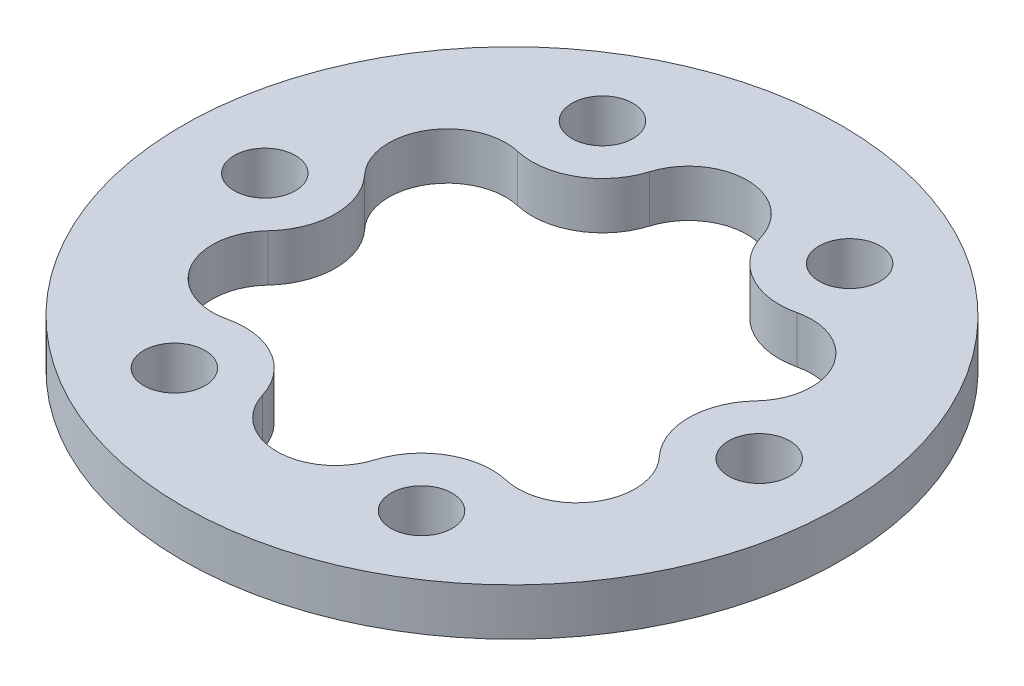
ISO-10303-21;
HEADER;
FILE_DESCRIPTION(('STEP AP214'),'2;1');
FILE_NAME('part.step','',(''),(''),'','','');
FILE_SCHEMA(('AUTOMOTIVE_DESIGN { 1 0 10303 214 1 1 1 1 }'));
ENDSEC;
DATA;
#1=APPLICATION_CONTEXT('core data for automotive mechanical design processes');
#2=APPLICATION_PROTOCOL_DEFINITION('international standard','automotive_design',2000,#1);
#3=PRODUCT_CONTEXT('',#1,'mechanical');
#4=PRODUCT('Part','Part','',(#3));
#5=PRODUCT_RELATED_PRODUCT_CATEGORY('part','',(#4));
#6=PRODUCT_DEFINITION_FORMATION('','',#4);
#7=PRODUCT_DEFINITION_CONTEXT('part definition',#1,'design');
#8=PRODUCT_DEFINITION('design','',#6,#7);
#9=PRODUCT_DEFINITION_SHAPE('','',#8);
#10=(LENGTH_UNIT() NAMED_UNIT(*) SI_UNIT(.MILLI.,.METRE.));
#11=(NAMED_UNIT(*) PLANE_ANGLE_UNIT() SI_UNIT($,.RADIAN.));
#12=(NAMED_UNIT(*) SI_UNIT($,.STERADIAN.) SOLID_ANGLE_UNIT());
#13=UNCERTAINTY_MEASURE_WITH_UNIT(LENGTH_MEASURE(1.E-05),#10,'distance_accuracy_value','');
#14=(GEOMETRIC_REPRESENTATION_CONTEXT(3) GLOBAL_UNCERTAINTY_ASSIGNED_CONTEXT((#13)) GLOBAL_UNIT_ASSIGNED_CONTEXT((#10,
#11,#12)) REPRESENTATION_CONTEXT('',''));
#15=CARTESIAN_POINT('',(0.,0.,0.));
#16=DIRECTION('',(0.,0.,1.));
#17=DIRECTION('',(1.,0.,0.));
#18=AXIS2_PLACEMENT_3D('',#15,#16,#17);
#19=CARTESIAN_POINT('',(0.,4.,0.));
#20=DIRECTION('',(0.,1.,0.));
#21=DIRECTION('',(0.,0.,-1.));
#22=AXIS2_PLACEMENT_3D('',#19,#20,#21);
#23=PLANE('',#22);
#24=CARTESIAN_POINT('',(-10.5000000000001,4.,18.1865334794733));
#25=DIRECTION('',(0.,-1.,0.));
#26=DIRECTION('',(0.,0.,-1.));
#27=AXIS2_PLACEMENT_3D('',#24,#25,#26);
#28=CIRCLE('',#27,2.6);
#29=CARTESIAN_POINT('',(-10.5000000000001,4.,15.5865334794733));
#30=VERTEX_POINT('',#29);
#31=EDGE_CURVE('E234',#30,#30,#28,.T.);
#32=ORIENTED_EDGE('',*,*,#31,.T.);
#33=EDGE_LOOP('',(#32));
#34=FACE_BOUND('',#33,.T.);
#35=CARTESIAN_POINT('',(-10.5000000000001,4.,-18.1865334794731));
#36=DIRECTION('',(0.,-1.,0.));
#37=DIRECTION('',(0.,0.,-1.));
#38=AXIS2_PLACEMENT_3D('',#35,#36,#37);
#39=CIRCLE('',#38,2.6);
#40=CARTESIAN_POINT('',(-10.5000000000001,4.,-20.7865334794731));
#41=VERTEX_POINT('',#40);
#42=EDGE_CURVE('E246',#41,#41,#39,.T.);
#43=ORIENTED_EDGE('',*,*,#42,.T.);
#44=EDGE_LOOP('',(#43));
#45=FACE_BOUND('',#44,.T.);
#46=CARTESIAN_POINT('',(20.9999999999999,4.,0.));
#47=DIRECTION('',(0.,-1.,0.));
#48=DIRECTION('',(0.,0.,-1.));
#49=AXIS2_PLACEMENT_3D('',#46,#47,#48);
#50=CIRCLE('',#49,2.6);
#51=CARTESIAN_POINT('',(20.9999999999999,4.,-2.59999999999992));
#52=VERTEX_POINT('',#51);
#53=EDGE_CURVE('E258',#52,#52,#50,.T.);
#54=ORIENTED_EDGE('',*,*,#53,.T.);
#55=EDGE_LOOP('',(#54));
#56=FACE_BOUND('',#55,.T.);
#57=CARTESIAN_POINT('',(0.,4.,0.));
#58=DIRECTION('',(0.,-1.,0.));
#59=DIRECTION('',(0.,0.,-1.));
#60=AXIS2_PLACEMENT_3D('',#57,#58,#59);
#61=CIRCLE('',#60,28.);
#62=CARTESIAN_POINT('',(0.,4.,-28.));
#63=VERTEX_POINT('',#62);
#64=EDGE_CURVE('E11',#63,#63,#61,.T.);
#65=ORIENTED_EDGE('',*,*,#64,.F.);
#66=EDGE_LOOP('',(#65));
#67=FACE_BOUND('',#66,.T.);
#68=CARTESIAN_POINT('',(10.4999999999999,4.,18.1865334794733));
#69=DIRECTION('',(0.,-1.,0.));
#70=DIRECTION('',(0.,0.,-1.));
#71=AXIS2_PLACEMENT_3D('',#68,#69,#70);
#72=CIRCLE('',#71,2.6);
#73=CARTESIAN_POINT('',(10.4999999999999,4.,15.5865334794733));
#74=VERTEX_POINT('',#73);
#75=EDGE_CURVE('E264',#74,#74,#72,.T.);
#76=ORIENTED_EDGE('',*,*,#75,.T.);
#77=EDGE_LOOP('',(#76));
#78=FACE_BOUND('',#77,.T.);
#79=CARTESIAN_POINT('',(10.4999999999999,4.,-18.1865334794731));
#80=DIRECTION('',(0.,-1.,0.));
#81=DIRECTION('',(0.,0.,-1.));
#82=AXIS2_PLACEMENT_3D('',#79,#80,#81);
#83=CIRCLE('',#82,2.6);
#84=CARTESIAN_POINT('',(10.4999999999999,4.,-20.7865334794731));
#85=VERTEX_POINT('',#84);
#86=EDGE_CURVE('E252',#85,#85,#83,.T.);
#87=ORIENTED_EDGE('',*,*,#86,.T.);
#88=EDGE_LOOP('',(#87));
#89=FACE_BOUND('',#88,.T.);
#90=CARTESIAN_POINT('',(-21.,4.,-1.2805208282618E-13));
#91=DIRECTION('',(0.,-1.,0.));
#92=DIRECTION('',(0.,0.,-1.));
#93=AXIS2_PLACEMENT_3D('',#90,#91,#92);
#94=CIRCLE('',#93,2.6);
#95=CARTESIAN_POINT('',(-21.,4.,-2.60000000000013));
#96=VERTEX_POINT('',#95);
#97=EDGE_CURVE('E240',#96,#96,#94,.T.);
#98=ORIENTED_EDGE('',*,*,#97,.T.);
#99=EDGE_LOOP('',(#98));
#100=FACE_BOUND('',#99,.T.);
#101=CARTESIAN_POINT('',(0.,4.,15.));
#102=DIRECTION('',(0.,-1.,0.));
#103=DIRECTION('',(0.,0.,-1.));
#104=AXIS2_PLACEMENT_3D('',#101,#102,#103);
#105=CIRCLE('',#104,4.97287544884216);
#106=CARTESIAN_POINT('',(4.75856966173357,4.,16.444127765859));
#107=VERTEX_POINT('',#106);
#108=CARTESIAN_POINT('',(-4.7585696630104,4.,16.444127761652));
#109=VERTEX_POINT('',#108);
#110=EDGE_CURVE('E231',#107,#109,#105,.T.);
#111=ORIENTED_EDGE('',*,*,#110,.T.);
#112=CARTESIAN_POINT('',(-10.4999999999999,4.,18.1865334794733));
#113=DIRECTION('',(0.,-1.,0.));
#114=DIRECTION('',(0.,0.,-1.));
#115=AXIS2_PLACEMENT_3D('',#112,#113,#114);
#116=CIRCLE('',#115,5.99999999999997);
#117=CARTESIAN_POINT('',(-11.8617475574442,4.,12.343106095669));
#118=VERTEX_POINT('',#117);
#119=EDGE_CURVE('E137',#109,#118,#116,.F.);
#120=ORIENTED_EDGE('',*,*,#119,.T.);
#121=CARTESIAN_POINT('',(-12.9903810567665,4.,7.50000000000015));
#122=DIRECTION('',(0.,-1.,0.));
#123=DIRECTION('',(0.,0.,-1.));
#124=AXIS2_PLACEMENT_3D('',#121,#122,#123);
#125=CIRCLE('',#124,4.97287544884218);
#126=CARTESIAN_POINT('',(-16.6203172161729,4.,4.10102166698107));
#127=VERTEX_POINT('',#126);
#128=EDGE_CURVE('E201',#118,#127,#125,.T.);
#129=ORIENTED_EDGE('',*,*,#128,.T.);
#130=CARTESIAN_POINT('',(-21.,4.,0.));
#131=DIRECTION('',(0.,-1.,0.));
#132=DIRECTION('',(0.,0.,-1.));
#133=AXIS2_PLACEMENT_3D('',#130,#131,#132);
#134=CIRCLE('',#133,5.99999999999996);
#135=CARTESIAN_POINT('',(-16.6203172191779,4.,-4.10102167019012));
#136=VERTEX_POINT('',#135);
#137=EDGE_CURVE('E204',#127,#136,#134,.F.);
#138=ORIENTED_EDGE('',*,*,#137,.T.);
#139=CARTESIAN_POINT('',(-12.9903810567667,4.,-7.49999999999988));
#140=DIRECTION('',(0.,-1.,0.));
#141=DIRECTION('',(0.,0.,-1.));
#142=AXIS2_PLACEMENT_3D('',#139,#140,#141);
#143=CIRCLE('',#142,4.97287544884216);
#144=CARTESIAN_POINT('',(-11.8617475531624,4.,-12.343106094671));
#145=VERTEX_POINT('',#144);
#146=EDGE_CURVE('E207',#136,#145,#143,.T.);
#147=ORIENTED_EDGE('',*,*,#146,.T.);
#148=CARTESIAN_POINT('',(-10.5,4.,-18.1865334794732));
#149=DIRECTION('',(0.,-1.,0.));
#150=DIRECTION('',(0.,0.,-1.));
#151=AXIS2_PLACEMENT_3D('',#148,#149,#150);
#152=CIRCLE('',#151,6.00000000000005);
#153=CARTESIAN_POINT('',(-4.75856966173378,4.,-16.4441277658589));
#154=VERTEX_POINT('',#153);
#155=EDGE_CURVE('E210',#145,#154,#152,.F.);
#156=ORIENTED_EDGE('',*,*,#155,.T.);
#157=CARTESIAN_POINT('',(-1.04517089427603E-13,4.,-15.));
#158=DIRECTION('',(0.,-1.,0.));
#159=DIRECTION('',(0.,0.,-1.));
#160=AXIS2_PLACEMENT_3D('',#157,#158,#159);
#161=CIRCLE('',#160,4.97287544884212);
#162=CARTESIAN_POINT('',(4.75856966301036,4.,-16.4441277616519));
#163=VERTEX_POINT('',#162);
#164=EDGE_CURVE('E213',#154,#163,#161,.T.);
#165=ORIENTED_EDGE('',*,*,#164,.T.);
#166=CARTESIAN_POINT('',(10.5,4.,-18.1865334794732));
#167=DIRECTION('',(0.,-1.,0.));
#168=DIRECTION('',(0.,0.,-1.));
#169=AXIS2_PLACEMENT_3D('',#166,#167,#168);
#170=CIRCLE('',#169,6.00000000000014);
#171=CARTESIAN_POINT('',(11.861747557444,4.,-12.3431060956688));
#172=VERTEX_POINT('',#171);
#173=EDGE_CURVE('E216',#163,#172,#170,.F.);
#174=ORIENTED_EDGE('',*,*,#173,.T.);
#175=CARTESIAN_POINT('',(12.9903810567665,4.,-7.50000000000006));
#176=DIRECTION('',(0.,-1.,0.));
#177=DIRECTION('',(0.,0.,-1.));
#178=AXIS2_PLACEMENT_3D('',#175,#176,#177);
#179=CIRCLE('',#178,4.97287544884211);
#180=CARTESIAN_POINT('',(16.6203172161726,4.,-4.10102166698093));
#181=VERTEX_POINT('',#180);
#182=EDGE_CURVE('E219',#172,#181,#179,.T.);
#183=ORIENTED_EDGE('',*,*,#182,.T.);
#184=CARTESIAN_POINT('',(21.,4.,0.));
#185=DIRECTION('',(0.,-1.,0.));
#186=DIRECTION('',(0.,0.,-1.));
#187=AXIS2_PLACEMENT_3D('',#184,#185,#186);
#188=CIRCLE('',#187,6.00000000000013);
#189=CARTESIAN_POINT('',(16.6203172191777,4.,4.10102167019017));
#190=VERTEX_POINT('',#189);
#191=EDGE_CURVE('E222',#181,#190,#188,.F.);
#192=ORIENTED_EDGE('',*,*,#191,.T.);
#193=CARTESIAN_POINT('',(12.9903810567666,4.,7.49999999999997));
#194=DIRECTION('',(0.,-1.,0.));
#195=DIRECTION('',(0.,0.,-1.));
#196=AXIS2_PLACEMENT_3D('',#193,#194,#195);
#197=CIRCLE('',#196,4.97287544884213);
#198=CARTESIAN_POINT('',(11.8617475531622,4.,12.343106094671));
#199=VERTEX_POINT('',#198);
#200=EDGE_CURVE('E225',#190,#199,#197,.T.);
#201=ORIENTED_EDGE('',*,*,#200,.T.);
#202=CARTESIAN_POINT('',(10.4999999999999,4.,18.1865334794733));
#203=DIRECTION('',(0.,-1.,0.));
#204=DIRECTION('',(0.,0.,-1.));
#205=AXIS2_PLACEMENT_3D('',#202,#203,#204);
#206=CIRCLE('',#205,6.00000000000005);
#207=EDGE_CURVE('E228',#199,#107,#206,.F.);
#208=ORIENTED_EDGE('',*,*,#207,.T.);
#209=EDGE_LOOP('',(#111,#120,#129,#138,#147,#156,#165,#174,#183,#192,#201,#208));
#210=FACE_BOUND('',#209,.T.);
#211=ADVANCED_FACE('F43',(#34,#45,#56,#67,#78,#89,#100,#210),#23,.T.);
#212=CARTESIAN_POINT('',(0.,0.,0.));
#213=DIRECTION('',(0.,1.,0.));
#214=DIRECTION('',(0.,0.,-1.));
#215=AXIS2_PLACEMENT_3D('',#212,#213,#214);
#216=PLANE('',#215);
#217=CARTESIAN_POINT('',(0.,0.,0.));
#218=DIRECTION('',(0.,-1.,0.));
#219=DIRECTION('',(0.,0.,-1.));
#220=AXIS2_PLACEMENT_3D('',#217,#218,#219);
#221=CIRCLE('',#220,28.);
#222=CARTESIAN_POINT('',(0.,0.,-28.));
#223=VERTEX_POINT('',#222);
#224=EDGE_CURVE('E47',#223,#223,#221,.T.);
#225=ORIENTED_EDGE('',*,*,#224,.T.);
#226=EDGE_LOOP('',(#225));
#227=FACE_BOUND('',#226,.T.);
#228=CARTESIAN_POINT('',(10.4999999999999,0.,18.1865334794733));
#229=DIRECTION('',(0.,-1.,0.));
#230=DIRECTION('',(0.,0.,-1.));
#231=AXIS2_PLACEMENT_3D('',#228,#229,#230);
#232=CIRCLE('',#231,2.6);
#233=CARTESIAN_POINT('',(10.4999999999999,0.,15.5865334794733));
#234=VERTEX_POINT('',#233);
#235=EDGE_CURVE('E261',#234,#234,#232,.T.);
#236=ORIENTED_EDGE('',*,*,#235,.F.);
#237=EDGE_LOOP('',(#236));
#238=FACE_BOUND('',#237,.T.);
#239=CARTESIAN_POINT('',(20.9999999999999,0.,0.));
#240=DIRECTION('',(0.,-1.,0.));
#241=DIRECTION('',(0.,0.,-1.));
#242=AXIS2_PLACEMENT_3D('',#239,#240,#241);
#243=CIRCLE('',#242,2.6);
#244=CARTESIAN_POINT('',(20.9999999999999,0.,-2.59999999999992));
#245=VERTEX_POINT('',#244);
#246=EDGE_CURVE('E255',#245,#245,#243,.T.);
#247=ORIENTED_EDGE('',*,*,#246,.F.);
#248=EDGE_LOOP('',(#247));
#249=FACE_BOUND('',#248,.T.);
#250=CARTESIAN_POINT('',(10.4999999999999,0.,-18.1865334794731));
#251=DIRECTION('',(0.,-1.,0.));
#252=DIRECTION('',(0.,0.,-1.));
#253=AXIS2_PLACEMENT_3D('',#250,#251,#252);
#254=CIRCLE('',#253,2.6);
#255=CARTESIAN_POINT('',(10.4999999999999,0.,-20.7865334794731));
#256=VERTEX_POINT('',#255);
#257=EDGE_CURVE('E249',#256,#256,#254,.T.);
#258=ORIENTED_EDGE('',*,*,#257,.F.);
#259=EDGE_LOOP('',(#258));
#260=FACE_BOUND('',#259,.T.);
#261=CARTESIAN_POINT('',(-10.5000000000001,0.,-18.1865334794731));
#262=DIRECTION('',(0.,-1.,0.));
#263=DIRECTION('',(0.,0.,-1.));
#264=AXIS2_PLACEMENT_3D('',#261,#262,#263);
#265=CIRCLE('',#264,2.6);
#266=CARTESIAN_POINT('',(-10.5000000000001,0.,-20.7865334794731));
#267=VERTEX_POINT('',#266);
#268=EDGE_CURVE('E243',#267,#267,#265,.T.);
#269=ORIENTED_EDGE('',*,*,#268,.F.);
#270=EDGE_LOOP('',(#269));
#271=FACE_BOUND('',#270,.T.);
#272=CARTESIAN_POINT('',(-21.,0.,-1.2805208282618E-13));
#273=DIRECTION('',(0.,-1.,0.));
#274=DIRECTION('',(0.,0.,-1.));
#275=AXIS2_PLACEMENT_3D('',#272,#273,#274);
#276=CIRCLE('',#275,2.6);
#277=CARTESIAN_POINT('',(-21.,0.,-2.60000000000013));
#278=VERTEX_POINT('',#277);
#279=EDGE_CURVE('E237',#278,#278,#276,.T.);
#280=ORIENTED_EDGE('',*,*,#279,.F.);
#281=EDGE_LOOP('',(#280));
#282=FACE_BOUND('',#281,.T.);
#283=CARTESIAN_POINT('',(-10.5000000000001,0.,18.1865334794733));
#284=DIRECTION('',(0.,-1.,0.));
#285=DIRECTION('',(0.,0.,-1.));
#286=AXIS2_PLACEMENT_3D('',#283,#284,#285);
#287=CIRCLE('',#286,2.6);
#288=CARTESIAN_POINT('',(-10.5000000000001,0.,15.5865334794733));
#289=VERTEX_POINT('',#288);
#290=EDGE_CURVE('E233',#289,#289,#287,.T.);
#291=ORIENTED_EDGE('',*,*,#290,.F.);
#292=EDGE_LOOP('',(#291));
#293=FACE_BOUND('',#292,.T.);
#294=CARTESIAN_POINT('',(10.4999999999999,0.,18.1865334794733));
#295=DIRECTION('',(0.,1.,0.));
#296=DIRECTION('',(0.,0.,-1.));
#297=AXIS2_PLACEMENT_3D('',#294,#295,#296);
#298=CIRCLE('',#297,6.00000000000005);
#299=CARTESIAN_POINT('',(11.8617475531622,0.,12.343106094671));
#300=VERTEX_POINT('',#299);
#301=CARTESIAN_POINT('',(4.75856966173357,0.,16.444127765859));
#302=VERTEX_POINT('',#301);
#303=EDGE_CURVE('E139',#300,#302,#298,.T.);
#304=ORIENTED_EDGE('',*,*,#303,.F.);
#305=CARTESIAN_POINT('',(12.9903810567666,0.,7.49999999999997));
#306=DIRECTION('',(0.,-1.,0.));
#307=DIRECTION('',(0.,0.,1.));
#308=AXIS2_PLACEMENT_3D('',#305,#306,#307);
#309=CIRCLE('',#308,4.97287544884213);
#310=CARTESIAN_POINT('',(16.6203172191777,0.,4.10102167019017));
#311=VERTEX_POINT('',#310);
#312=EDGE_CURVE('E176',#311,#300,#309,.T.);
#313=ORIENTED_EDGE('',*,*,#312,.F.);
#314=CARTESIAN_POINT('',(21.,0.,0.));
#315=DIRECTION('',(0.,1.,0.));
#316=DIRECTION('',(0.,0.,-1.));
#317=AXIS2_PLACEMENT_3D('',#314,#315,#316);
#318=CIRCLE('',#317,6.00000000000013);
#319=CARTESIAN_POINT('',(16.6203172161726,0.,-4.10102166698093));
#320=VERTEX_POINT('',#319);
#321=EDGE_CURVE('E173',#320,#311,#318,.T.);
#322=ORIENTED_EDGE('',*,*,#321,.F.);
#323=CARTESIAN_POINT('',(12.9903810567665,0.,-7.50000000000006));
#324=DIRECTION('',(0.,-1.,0.));
#325=DIRECTION('',(0.,0.,1.));
#326=AXIS2_PLACEMENT_3D('',#323,#324,#325);
#327=CIRCLE('',#326,4.97287544884211);
#328=CARTESIAN_POINT('',(11.861747557444,0.,-12.3431060956688));
#329=VERTEX_POINT('',#328);
#330=EDGE_CURVE('E170',#329,#320,#327,.T.);
#331=ORIENTED_EDGE('',*,*,#330,.F.);
#332=CARTESIAN_POINT('',(10.5,0.,-18.1865334794732));
#333=DIRECTION('',(0.,1.,0.));
#334=DIRECTION('',(0.,0.,-1.));
#335=AXIS2_PLACEMENT_3D('',#332,#333,#334);
#336=CIRCLE('',#335,6.00000000000014);
#337=CARTESIAN_POINT('',(4.75856966301036,0.,-16.4441277616519));
#338=VERTEX_POINT('',#337);
#339=EDGE_CURVE('E167',#338,#329,#336,.T.);
#340=ORIENTED_EDGE('',*,*,#339,.F.);
#341=CARTESIAN_POINT('',(-1.04517089427603E-13,0.,-15.));
#342=DIRECTION('',(0.,-1.,0.));
#343=DIRECTION('',(0.,0.,1.));
#344=AXIS2_PLACEMENT_3D('',#341,#342,#343);
#345=CIRCLE('',#344,4.97287544884212);
#346=CARTESIAN_POINT('',(-4.75856966173378,0.,-16.4441277658589));
#347=VERTEX_POINT('',#346);
#348=EDGE_CURVE('E164',#347,#338,#345,.T.);
#349=ORIENTED_EDGE('',*,*,#348,.F.);
#350=CARTESIAN_POINT('',(-10.5,0.,-18.1865334794732));
#351=DIRECTION('',(0.,1.,0.));
#352=DIRECTION('',(0.,0.,-1.));
#353=AXIS2_PLACEMENT_3D('',#350,#351,#352);
#354=CIRCLE('',#353,6.00000000000005);
#355=CARTESIAN_POINT('',(-11.8617475531624,0.,-12.343106094671));
#356=VERTEX_POINT('',#355);
#357=EDGE_CURVE('E161',#356,#347,#354,.T.);
#358=ORIENTED_EDGE('',*,*,#357,.F.);
#359=CARTESIAN_POINT('',(-12.9903810567667,0.,-7.49999999999988));
#360=DIRECTION('',(0.,-1.,0.));
#361=DIRECTION('',(0.,0.,1.));
#362=AXIS2_PLACEMENT_3D('',#359,#360,#361);
#363=CIRCLE('',#362,4.97287544884216);
#364=CARTESIAN_POINT('',(-16.6203172191779,0.,-4.10102167019012));
#365=VERTEX_POINT('',#364);
#366=EDGE_CURVE('E158',#365,#356,#363,.T.);
#367=ORIENTED_EDGE('',*,*,#366,.F.);
#368=CARTESIAN_POINT('',(-21.,0.,0.));
#369=DIRECTION('',(0.,1.,0.));
#370=DIRECTION('',(0.,0.,-1.));
#371=AXIS2_PLACEMENT_3D('',#368,#369,#370);
#372=CIRCLE('',#371,5.99999999999996);
#373=CARTESIAN_POINT('',(-16.6203172161729,0.,4.10102166698107));
#374=VERTEX_POINT('',#373);
#375=EDGE_CURVE('E153',#374,#365,#372,.T.);
#376=ORIENTED_EDGE('',*,*,#375,.F.);
#377=CARTESIAN_POINT('',(-12.9903810567665,0.,7.50000000000015));
#378=DIRECTION('',(0.,-1.,0.));
#379=DIRECTION('',(0.,0.,1.));
#380=AXIS2_PLACEMENT_3D('',#377,#378,#379);
#381=CIRCLE('',#380,4.97287544884218);
#382=CARTESIAN_POINT('',(-11.8617475574442,0.,12.343106095669));
#383=VERTEX_POINT('',#382);
#384=EDGE_CURVE('E151',#383,#374,#381,.T.);
#385=ORIENTED_EDGE('',*,*,#384,.F.);
#386=CARTESIAN_POINT('',(-10.4999999999999,0.,18.1865334794733));
#387=DIRECTION('',(0.,1.,0.));
#388=DIRECTION('',(0.,0.,-1.));
#389=AXIS2_PLACEMENT_3D('',#386,#387,#388);
#390=CIRCLE('',#389,5.99999999999997);
#391=CARTESIAN_POINT('',(-4.7585696630104,0.,16.444127761652));
#392=VERTEX_POINT('',#391);
#393=EDGE_CURVE('E134',#392,#383,#390,.T.);
#394=ORIENTED_EDGE('',*,*,#393,.F.);
#395=CARTESIAN_POINT('',(0.,0.,15.));
#396=DIRECTION('',(0.,-1.,0.));
#397=DIRECTION('',(0.,0.,1.));
#398=AXIS2_PLACEMENT_3D('',#395,#396,#397);
#399=CIRCLE('',#398,4.97287544884216);
#400=EDGE_CURVE('E142',#302,#392,#399,.T.);
#401=ORIENTED_EDGE('',*,*,#400,.F.);
#402=EDGE_LOOP('',(#304,#313,#322,#331,#340,#349,#358,#367,#376,#385,#394,#401));
#403=FACE_BOUND('',#402,.T.);
#404=ADVANCED_FACE('F149',(#227,#238,#249,#260,#271,#282,#293,#403),#216,.F.);
#405=CARTESIAN_POINT('',(0.,4.,0.));
#406=DIRECTION('',(0.,-1.,0.));
#407=DIRECTION('',(0.,0.,1.));
#408=AXIS2_PLACEMENT_3D('',#405,#406,#407);
#409=CYLINDRICAL_SURFACE('',#408,28.);
#410=ORIENTED_EDGE('',*,*,#64,.T.);
#411=EDGE_LOOP('',(#410));
#412=FACE_BOUND('',#411,.T.);
#413=ORIENTED_EDGE('',*,*,#224,.F.);
#414=EDGE_LOOP('',(#413));
#415=FACE_BOUND('',#414,.T.);
#416=ADVANCED_FACE('F45',(#412,#415),#409,.T.);
#417=CARTESIAN_POINT('',(10.4999999999999,4.,18.1865334794733));
#418=DIRECTION('',(0.,-1.,0.));
#419=DIRECTION('',(0.,0.,1.));
#420=AXIS2_PLACEMENT_3D('',#417,#418,#419);
#421=CYLINDRICAL_SURFACE('',#420,2.6);
#422=ORIENTED_EDGE('',*,*,#75,.F.);
#423=EDGE_LOOP('',(#422));
#424=FACE_BOUND('',#423,.T.);
#425=ORIENTED_EDGE('',*,*,#235,.T.);
#426=EDGE_LOOP('',(#425));
#427=FACE_BOUND('',#426,.T.);
#428=ADVANCED_FACE('F270',(#424,#427),#421,.F.);
#429=CARTESIAN_POINT('',(20.9999999999999,4.,0.));
#430=DIRECTION('',(0.,-1.,0.));
#431=DIRECTION('',(0.,0.,1.));
#432=AXIS2_PLACEMENT_3D('',#429,#430,#431);
#433=CYLINDRICAL_SURFACE('',#432,2.6);
#434=ORIENTED_EDGE('',*,*,#53,.F.);
#435=EDGE_LOOP('',(#434));
#436=FACE_BOUND('',#435,.T.);
#437=ORIENTED_EDGE('',*,*,#246,.T.);
#438=EDGE_LOOP('',(#437));
#439=FACE_BOUND('',#438,.T.);
#440=ADVANCED_FACE('F310',(#436,#439),#433,.F.);
#441=CARTESIAN_POINT('',(10.4999999999999,4.,-18.1865334794731));
#442=DIRECTION('',(0.,-1.,0.));
#443=DIRECTION('',(0.,0.,1.));
#444=AXIS2_PLACEMENT_3D('',#441,#442,#443);
#445=CYLINDRICAL_SURFACE('',#444,2.6);
#446=ORIENTED_EDGE('',*,*,#86,.F.);
#447=EDGE_LOOP('',(#446));
#448=FACE_BOUND('',#447,.T.);
#449=ORIENTED_EDGE('',*,*,#257,.T.);
#450=EDGE_LOOP('',(#449));
#451=FACE_BOUND('',#450,.T.);
#452=ADVANCED_FACE('F313',(#448,#451),#445,.F.);
#453=CARTESIAN_POINT('',(-10.5000000000001,4.,-18.1865334794731));
#454=DIRECTION('',(0.,-1.,0.));
#455=DIRECTION('',(0.,0.,1.));
#456=AXIS2_PLACEMENT_3D('',#453,#454,#455);
#457=CYLINDRICAL_SURFACE('',#456,2.6);
#458=ORIENTED_EDGE('',*,*,#42,.F.);
#459=EDGE_LOOP('',(#458));
#460=FACE_BOUND('',#459,.T.);
#461=ORIENTED_EDGE('',*,*,#268,.T.);
#462=EDGE_LOOP('',(#461));
#463=FACE_BOUND('',#462,.T.);
#464=ADVANCED_FACE('F297',(#460,#463),#457,.F.);
#465=CARTESIAN_POINT('',(-21.,4.,-1.2805208282618E-13));
#466=DIRECTION('',(0.,-1.,0.));
#467=DIRECTION('',(0.,0.,1.));
#468=AXIS2_PLACEMENT_3D('',#465,#466,#467);
#469=CYLINDRICAL_SURFACE('',#468,2.6);
#470=ORIENTED_EDGE('',*,*,#97,.F.);
#471=EDGE_LOOP('',(#470));
#472=FACE_BOUND('',#471,.T.);
#473=ORIENTED_EDGE('',*,*,#279,.T.);
#474=EDGE_LOOP('',(#473));
#475=FACE_BOUND('',#474,.T.);
#476=ADVANCED_FACE('F287',(#472,#475),#469,.F.);
#477=CARTESIAN_POINT('',(-10.5000000000001,4.,18.1865334794733));
#478=DIRECTION('',(0.,-1.,0.));
#479=DIRECTION('',(0.,0.,1.));
#480=AXIS2_PLACEMENT_3D('',#477,#478,#479);
#481=CYLINDRICAL_SURFACE('',#480,2.6);
#482=ORIENTED_EDGE('',*,*,#31,.F.);
#483=EDGE_LOOP('',(#482));
#484=FACE_BOUND('',#483,.T.);
#485=ORIENTED_EDGE('',*,*,#290,.T.);
#486=EDGE_LOOP('',(#485));
#487=FACE_BOUND('',#486,.T.);
#488=ADVANCED_FACE('F285',(#484,#487),#481,.F.);
#489=CARTESIAN_POINT('',(0.,0.,15.));
#490=DIRECTION('',(0.,1.,0.));
#491=DIRECTION('',(0.,0.,-1.));
#492=AXIS2_PLACEMENT_3D('',#489,#490,#491);
#493=CYLINDRICAL_SURFACE('',#492,4.97287544884216);
#494=ORIENTED_EDGE('',*,*,#110,.F.);
#495=DIRECTION('',(0.,1.,0.));
#496=VECTOR('',#495,1.);
#497=CARTESIAN_POINT('',(4.75856966173357,0.,16.444127765859));
#498=LINE('',#497,#496);
#499=EDGE_CURVE('E144',#302,#107,#498,.T.);
#500=ORIENTED_EDGE('',*,*,#499,.F.);
#501=ORIENTED_EDGE('',*,*,#400,.T.);
#502=DIRECTION('',(0.,1.,0.));
#503=VECTOR('',#502,1.);
#504=CARTESIAN_POINT('',(-4.7585696630104,0.,16.444127761652));
#505=LINE('',#504,#503);
#506=EDGE_CURVE('E58',#392,#109,#505,.T.);
#507=ORIENTED_EDGE('',*,*,#506,.T.);
#508=EDGE_LOOP('',(#494,#500,#501,#507));
#509=FACE_BOUND('',#508,.T.);
#510=ADVANCED_FACE('F143',(#509),#493,.F.);
#511=CARTESIAN_POINT('',(10.4999999999999,0.,18.1865334794733));
#512=DIRECTION('',(0.,1.,0.));
#513=DIRECTION('',(0.,0.,-1.));
#514=AXIS2_PLACEMENT_3D('',#511,#512,#513);
#515=CYLINDRICAL_SURFACE('',#514,6.00000000000005);
#516=ORIENTED_EDGE('',*,*,#207,.F.);
#517=DIRECTION('',(0.,1.,0.));
#518=VECTOR('',#517,1.);
#519=CARTESIAN_POINT('',(11.8617475531622,0.,12.343106094671));
#520=LINE('',#519,#518);
#521=EDGE_CURVE('E181',#300,#199,#520,.T.);
#522=ORIENTED_EDGE('',*,*,#521,.F.);
#523=ORIENTED_EDGE('',*,*,#303,.T.);
#524=ORIENTED_EDGE('',*,*,#499,.T.);
#525=EDGE_LOOP('',(#516,#522,#523,#524));
#526=FACE_BOUND('',#525,.T.);
#527=ADVANCED_FACE('F295',(#526),#515,.T.);
#528=CARTESIAN_POINT('',(12.9903810567666,0.,7.49999999999997));
#529=DIRECTION('',(0.,1.,0.));
#530=DIRECTION('',(0.,0.,-1.));
#531=AXIS2_PLACEMENT_3D('',#528,#529,#530);
#532=CYLINDRICAL_SURFACE('',#531,4.97287544884213);
#533=ORIENTED_EDGE('',*,*,#200,.F.);
#534=DIRECTION('',(0.,1.,0.));
#535=VECTOR('',#534,1.);
#536=CARTESIAN_POINT('',(16.6203172191777,0.,4.10102167019017));
#537=LINE('',#536,#535);
#538=EDGE_CURVE('E183',#311,#190,#537,.T.);
#539=ORIENTED_EDGE('',*,*,#538,.F.);
#540=ORIENTED_EDGE('',*,*,#312,.T.);
#541=ORIENTED_EDGE('',*,*,#521,.T.);
#542=EDGE_LOOP('',(#533,#539,#540,#541));
#543=FACE_BOUND('',#542,.T.);
#544=ADVANCED_FACE('F342',(#543),#532,.F.);
#545=CARTESIAN_POINT('',(21.,0.,0.));
#546=DIRECTION('',(0.,1.,0.));
#547=DIRECTION('',(0.,0.,-1.));
#548=AXIS2_PLACEMENT_3D('',#545,#546,#547);
#549=CYLINDRICAL_SURFACE('',#548,6.00000000000013);
#550=ORIENTED_EDGE('',*,*,#191,.F.);
#551=DIRECTION('',(0.,1.,0.));
#552=VECTOR('',#551,1.);
#553=CARTESIAN_POINT('',(16.6203172161726,0.,-4.10102166698093));
#554=LINE('',#553,#552);
#555=EDGE_CURVE('E185',#320,#181,#554,.T.);
#556=ORIENTED_EDGE('',*,*,#555,.F.);
#557=ORIENTED_EDGE('',*,*,#321,.T.);
#558=ORIENTED_EDGE('',*,*,#538,.T.);
#559=EDGE_LOOP('',(#550,#556,#557,#558));
#560=FACE_BOUND('',#559,.T.);
#561=ADVANCED_FACE('F345',(#560),#549,.T.);
#562=CARTESIAN_POINT('',(12.9903810567665,0.,-7.50000000000006));
#563=DIRECTION('',(0.,1.,0.));
#564=DIRECTION('',(0.,0.,-1.));
#565=AXIS2_PLACEMENT_3D('',#562,#563,#564);
#566=CYLINDRICAL_SURFACE('',#565,4.97287544884211);
#567=ORIENTED_EDGE('',*,*,#182,.F.);
#568=DIRECTION('',(0.,1.,0.));
#569=VECTOR('',#568,1.);
#570=CARTESIAN_POINT('',(11.861747557444,0.,-12.3431060956688));
#571=LINE('',#570,#569);
#572=EDGE_CURVE('E187',#329,#172,#571,.T.);
#573=ORIENTED_EDGE('',*,*,#572,.F.);
#574=ORIENTED_EDGE('',*,*,#330,.T.);
#575=ORIENTED_EDGE('',*,*,#555,.T.);
#576=EDGE_LOOP('',(#567,#573,#574,#575));
#577=FACE_BOUND('',#576,.T.);
#578=ADVANCED_FACE('F348',(#577),#566,.F.);
#579=CARTESIAN_POINT('',(10.5,0.,-18.1865334794732));
#580=DIRECTION('',(0.,1.,0.));
#581=DIRECTION('',(0.,0.,-1.));
#582=AXIS2_PLACEMENT_3D('',#579,#580,#581);
#583=CYLINDRICAL_SURFACE('',#582,6.00000000000014);
#584=ORIENTED_EDGE('',*,*,#173,.F.);
#585=DIRECTION('',(0.,1.,0.));
#586=VECTOR('',#585,1.);
#587=CARTESIAN_POINT('',(4.75856966301036,0.,-16.4441277616519));
#588=LINE('',#587,#586);
#589=EDGE_CURVE('E189',#338,#163,#588,.T.);
#590=ORIENTED_EDGE('',*,*,#589,.F.);
#591=ORIENTED_EDGE('',*,*,#339,.T.);
#592=ORIENTED_EDGE('',*,*,#572,.T.);
#593=EDGE_LOOP('',(#584,#590,#591,#592));
#594=FACE_BOUND('',#593,.T.);
#595=ADVANCED_FACE('F354',(#594),#583,.T.);
#596=CARTESIAN_POINT('',(-1.04517089427603E-13,0.,-15.));
#597=DIRECTION('',(0.,1.,0.));
#598=DIRECTION('',(0.,0.,-1.));
#599=AXIS2_PLACEMENT_3D('',#596,#597,#598);
#600=CYLINDRICAL_SURFACE('',#599,4.97287544884212);
#601=ORIENTED_EDGE('',*,*,#164,.F.);
#602=DIRECTION('',(0.,1.,0.));
#603=VECTOR('',#602,1.);
#604=CARTESIAN_POINT('',(-4.75856966173378,0.,-16.4441277658589));
#605=LINE('',#604,#603);
#606=EDGE_CURVE('E191',#347,#154,#605,.T.);
#607=ORIENTED_EDGE('',*,*,#606,.F.);
#608=ORIENTED_EDGE('',*,*,#348,.T.);
#609=ORIENTED_EDGE('',*,*,#589,.T.);
#610=EDGE_LOOP('',(#601,#607,#608,#609));
#611=FACE_BOUND('',#610,.T.);
#612=ADVANCED_FACE('F357',(#611),#600,.F.);
#613=CARTESIAN_POINT('',(-10.5,0.,-18.1865334794732));
#614=DIRECTION('',(0.,1.,0.));
#615=DIRECTION('',(0.,0.,-1.));
#616=AXIS2_PLACEMENT_3D('',#613,#614,#615);
#617=CYLINDRICAL_SURFACE('',#616,6.00000000000005);
#618=ORIENTED_EDGE('',*,*,#155,.F.);
#619=DIRECTION('',(0.,1.,0.));
#620=VECTOR('',#619,1.);
#621=CARTESIAN_POINT('',(-11.8617475531624,0.,-12.343106094671));
#622=LINE('',#621,#620);
#623=EDGE_CURVE('E193',#356,#145,#622,.T.);
#624=ORIENTED_EDGE('',*,*,#623,.F.);
#625=ORIENTED_EDGE('',*,*,#357,.T.);
#626=ORIENTED_EDGE('',*,*,#606,.T.);
#627=EDGE_LOOP('',(#618,#624,#625,#626));
#628=FACE_BOUND('',#627,.T.);
#629=ADVANCED_FACE('F360',(#628),#617,.T.);
#630=CARTESIAN_POINT('',(-12.9903810567667,0.,-7.49999999999988));
#631=DIRECTION('',(0.,1.,0.));
#632=DIRECTION('',(0.,0.,-1.));
#633=AXIS2_PLACEMENT_3D('',#630,#631,#632);
#634=CYLINDRICAL_SURFACE('',#633,4.97287544884216);
#635=ORIENTED_EDGE('',*,*,#146,.F.);
#636=DIRECTION('',(0.,1.,0.));
#637=VECTOR('',#636,1.);
#638=CARTESIAN_POINT('',(-16.6203172191779,0.,-4.10102167019012));
#639=LINE('',#638,#637);
#640=EDGE_CURVE('E195',#365,#136,#639,.T.);
#641=ORIENTED_EDGE('',*,*,#640,.F.);
#642=ORIENTED_EDGE('',*,*,#366,.T.);
#643=ORIENTED_EDGE('',*,*,#623,.T.);
#644=EDGE_LOOP('',(#635,#641,#642,#643));
#645=FACE_BOUND('',#644,.T.);
#646=ADVANCED_FACE('F364',(#645),#634,.F.);
#647=CARTESIAN_POINT('',(-21.,0.,0.));
#648=DIRECTION('',(0.,1.,0.));
#649=DIRECTION('',(0.,0.,-1.));
#650=AXIS2_PLACEMENT_3D('',#647,#648,#649);
#651=CYLINDRICAL_SURFACE('',#650,5.99999999999996);
#652=ORIENTED_EDGE('',*,*,#137,.F.);
#653=DIRECTION('',(0.,1.,0.));
#654=VECTOR('',#653,1.);
#655=CARTESIAN_POINT('',(-16.6203172161729,0.,4.10102166698107));
#656=LINE('',#655,#654);
#657=EDGE_CURVE('E197',#374,#127,#656,.T.);
#658=ORIENTED_EDGE('',*,*,#657,.F.);
#659=ORIENTED_EDGE('',*,*,#375,.T.);
#660=ORIENTED_EDGE('',*,*,#640,.T.);
#661=EDGE_LOOP('',(#652,#658,#659,#660));
#662=FACE_BOUND('',#661,.T.);
#663=ADVANCED_FACE('F367',(#662),#651,.T.);
#664=CARTESIAN_POINT('',(-12.9903810567665,0.,7.50000000000015));
#665=DIRECTION('',(0.,1.,0.));
#666=DIRECTION('',(0.,0.,-1.));
#667=AXIS2_PLACEMENT_3D('',#664,#665,#666);
#668=CYLINDRICAL_SURFACE('',#667,4.97287544884218);
#669=ORIENTED_EDGE('',*,*,#128,.F.);
#670=DIRECTION('',(0.,1.,0.));
#671=VECTOR('',#670,1.);
#672=CARTESIAN_POINT('',(-11.8617475574442,0.,12.343106095669));
#673=LINE('',#672,#671);
#674=EDGE_CURVE('E66',#383,#118,#673,.T.);
#675=ORIENTED_EDGE('',*,*,#674,.F.);
#676=ORIENTED_EDGE('',*,*,#384,.T.);
#677=ORIENTED_EDGE('',*,*,#657,.T.);
#678=EDGE_LOOP('',(#669,#675,#676,#677));
#679=FACE_BOUND('',#678,.T.);
#680=ADVANCED_FACE('F368',(#679),#668,.F.);
#681=CARTESIAN_POINT('',(-10.4999999999999,0.,18.1865334794733));
#682=DIRECTION('',(0.,1.,0.));
#683=DIRECTION('',(0.,0.,-1.));
#684=AXIS2_PLACEMENT_3D('',#681,#682,#683);
#685=CYLINDRICAL_SURFACE('',#684,5.99999999999997);
#686=ORIENTED_EDGE('',*,*,#119,.F.);
#687=ORIENTED_EDGE('',*,*,#506,.F.);
#688=ORIENTED_EDGE('',*,*,#393,.T.);
#689=ORIENTED_EDGE('',*,*,#674,.T.);
#690=EDGE_LOOP('',(#686,#687,#688,#689));
#691=FACE_BOUND('',#690,.T.);
#692=ADVANCED_FACE('F132',(#691),#685,.T.);
#693=CLOSED_SHELL('',(#211,#404,#416,#428,#440,#452,#464,#476,#488,#510,#527,#544,#561,#578,
#595,#612,#629,#646,#663,#680,#692));
#694=MANIFOLD_SOLID_BREP('B2',#693);
#695=ADVANCED_BREP_SHAPE_REPRESENTATION('',(#18,#694),#14);
#696=SHAPE_DEFINITION_REPRESENTATION(#9,#695);
ENDSEC;
END-ISO-10303-21;
